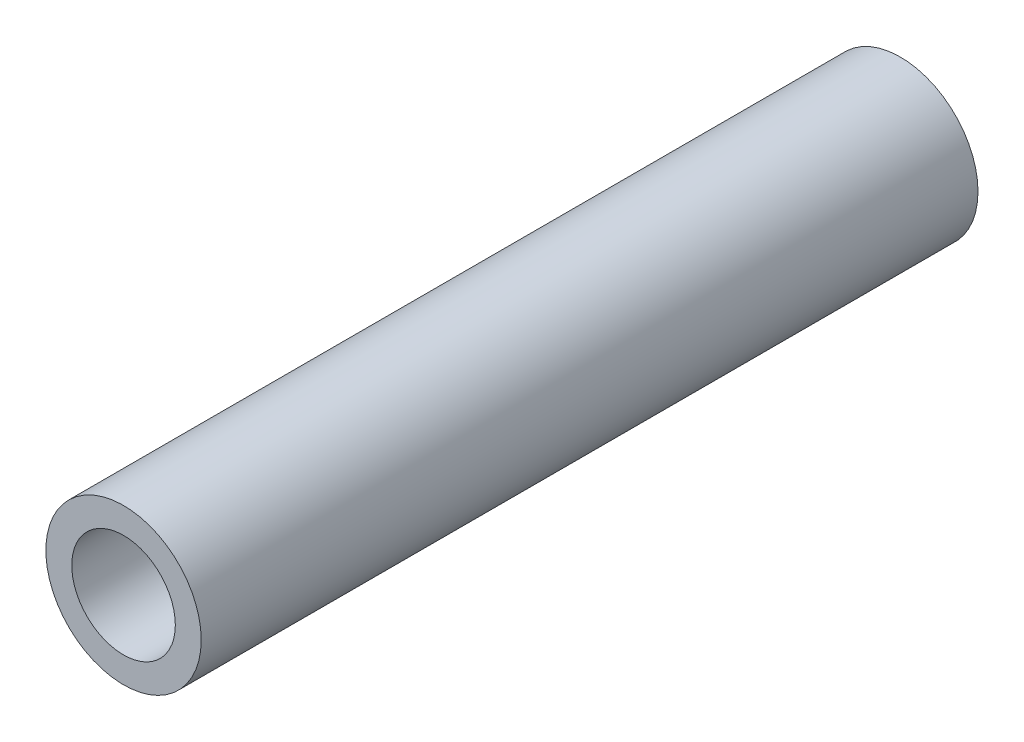
ISO-10303-21;
HEADER;
FILE_DESCRIPTION(('STEP AP214'),'2;1');
FILE_NAME('part.step','',(''),(''),'','','');
FILE_SCHEMA(('AUTOMOTIVE_DESIGN { 1 0 10303 214 1 1 1 1 }'));
ENDSEC;
DATA;
#1=APPLICATION_CONTEXT('core data for automotive mechanical design processes');
#2=APPLICATION_PROTOCOL_DEFINITION('international standard','automotive_design',2000,#1);
#3=PRODUCT_CONTEXT('',#1,'mechanical');
#4=PRODUCT('Part','Part','',(#3));
#5=PRODUCT_RELATED_PRODUCT_CATEGORY('part','',(#4));
#6=PRODUCT_DEFINITION_FORMATION('','',#4);
#7=PRODUCT_DEFINITION_CONTEXT('part definition',#1,'design');
#8=PRODUCT_DEFINITION('design','',#6,#7);
#9=PRODUCT_DEFINITION_SHAPE('','',#8);
#10=(LENGTH_UNIT() NAMED_UNIT(*) SI_UNIT(.MILLI.,.METRE.));
#11=(NAMED_UNIT(*) PLANE_ANGLE_UNIT() SI_UNIT($,.RADIAN.));
#12=(NAMED_UNIT(*) SI_UNIT($,.STERADIAN.) SOLID_ANGLE_UNIT());
#13=UNCERTAINTY_MEASURE_WITH_UNIT(LENGTH_MEASURE(1.E-05),#10,'distance_accuracy_value','');
#14=(GEOMETRIC_REPRESENTATION_CONTEXT(3) GLOBAL_UNCERTAINTY_ASSIGNED_CONTEXT((#13)) GLOBAL_UNIT_ASSIGNED_CONTEXT((#10,
#11,#12)) REPRESENTATION_CONTEXT('',''));
#15=CARTESIAN_POINT('',(0.,0.,0.));
#16=DIRECTION('',(0.,0.,1.));
#17=DIRECTION('',(1.,0.,0.));
#18=AXIS2_PLACEMENT_3D('',#15,#16,#17);
#19=CARTESIAN_POINT('',(0.,0.,30.));
#20=DIRECTION('',(0.,0.,1.));
#21=DIRECTION('',(1.,0.,0.));
#22=AXIS2_PLACEMENT_3D('',#19,#20,#21);
#23=PLANE('',#22);
#24=CARTESIAN_POINT('',(0.,0.,30.));
#25=DIRECTION('',(0.,0.,1.));
#26=DIRECTION('',(1.,0.,0.));
#27=AXIS2_PLACEMENT_3D('',#24,#25,#26);
#28=CIRCLE('',#27,3.);
#29=CARTESIAN_POINT('',(3.,0.,30.));
#30=VERTEX_POINT('',#29);
#31=EDGE_CURVE('E10',#30,#30,#28,.T.);
#32=ORIENTED_EDGE('',*,*,#31,.T.);
#33=EDGE_LOOP('',(#32));
#34=FACE_BOUND('',#33,.T.);
#35=CARTESIAN_POINT('',(0.,0.,30.));
#36=DIRECTION('',(0.,0.,1.));
#37=DIRECTION('',(1.,0.,0.));
#38=AXIS2_PLACEMENT_3D('',#35,#36,#37);
#39=CIRCLE('',#38,2.);
#40=CARTESIAN_POINT('',(2.,0.,30.));
#41=VERTEX_POINT('',#40);
#42=EDGE_CURVE('E44',#41,#41,#39,.T.);
#43=ORIENTED_EDGE('',*,*,#42,.F.);
#44=EDGE_LOOP('',(#43));
#45=FACE_BOUND('',#44,.T.);
#46=ADVANCED_FACE('F33',(#34,#45),#23,.T.);
#47=CARTESIAN_POINT('',(0.,0.,0.));
#48=DIRECTION('',(0.,0.,1.));
#49=DIRECTION('',(1.,0.,0.));
#50=AXIS2_PLACEMENT_3D('',#47,#48,#49);
#51=PLANE('',#50);
#52=CARTESIAN_POINT('',(0.,0.,0.));
#53=DIRECTION('',(0.,0.,1.));
#54=DIRECTION('',(1.,0.,0.));
#55=AXIS2_PLACEMENT_3D('',#52,#53,#54);
#56=CIRCLE('',#55,3.);
#57=CARTESIAN_POINT('',(3.,0.,0.));
#58=VERTEX_POINT('',#57);
#59=EDGE_CURVE('E37',#58,#58,#56,.T.);
#60=ORIENTED_EDGE('',*,*,#59,.F.);
#61=EDGE_LOOP('',(#60));
#62=FACE_BOUND('',#61,.T.);
#63=CARTESIAN_POINT('',(0.,0.,0.));
#64=DIRECTION('',(0.,0.,1.));
#65=DIRECTION('',(1.,0.,0.));
#66=AXIS2_PLACEMENT_3D('',#63,#64,#65);
#67=CIRCLE('',#66,2.);
#68=CARTESIAN_POINT('',(2.,0.,0.));
#69=VERTEX_POINT('',#68);
#70=EDGE_CURVE('E46',#69,#69,#67,.T.);
#71=ORIENTED_EDGE('',*,*,#70,.T.);
#72=EDGE_LOOP('',(#71));
#73=FACE_BOUND('',#72,.T.);
#74=ADVANCED_FACE('F56',(#62,#73),#51,.F.);
#75=CARTESIAN_POINT('',(0.,0.,30.));
#76=DIRECTION('',(0.,0.,-1.));
#77=DIRECTION('',(-1.,0.,0.));
#78=AXIS2_PLACEMENT_3D('',#75,#76,#77);
#79=CYLINDRICAL_SURFACE('',#78,3.);
#80=ORIENTED_EDGE('',*,*,#31,.F.);
#81=EDGE_LOOP('',(#80));
#82=FACE_BOUND('',#81,.T.);
#83=ORIENTED_EDGE('',*,*,#59,.T.);
#84=EDGE_LOOP('',(#83));
#85=FACE_BOUND('',#84,.T.);
#86=ADVANCED_FACE('F35',(#82,#85),#79,.T.);
#87=CARTESIAN_POINT('',(0.,0.,30.));
#88=DIRECTION('',(0.,0.,-1.));
#89=DIRECTION('',(-1.,0.,0.));
#90=AXIS2_PLACEMENT_3D('',#87,#88,#89);
#91=CYLINDRICAL_SURFACE('',#90,2.);
#92=ORIENTED_EDGE('',*,*,#42,.T.);
#93=EDGE_LOOP('',(#92));
#94=FACE_BOUND('',#93,.T.);
#95=ORIENTED_EDGE('',*,*,#70,.F.);
#96=EDGE_LOOP('',(#95));
#97=FACE_BOUND('',#96,.T.);
#98=ADVANCED_FACE('F52',(#94,#97),#91,.F.);
#99=CLOSED_SHELL('',(#46,#74,#86,#98));
#100=MANIFOLD_SOLID_BREP('B2',#99);
#101=ADVANCED_BREP_SHAPE_REPRESENTATION('',(#18,#100),#14);
#102=SHAPE_DEFINITION_REPRESENTATION(#9,#101);
ENDSEC;
END-ISO-10303-21;
